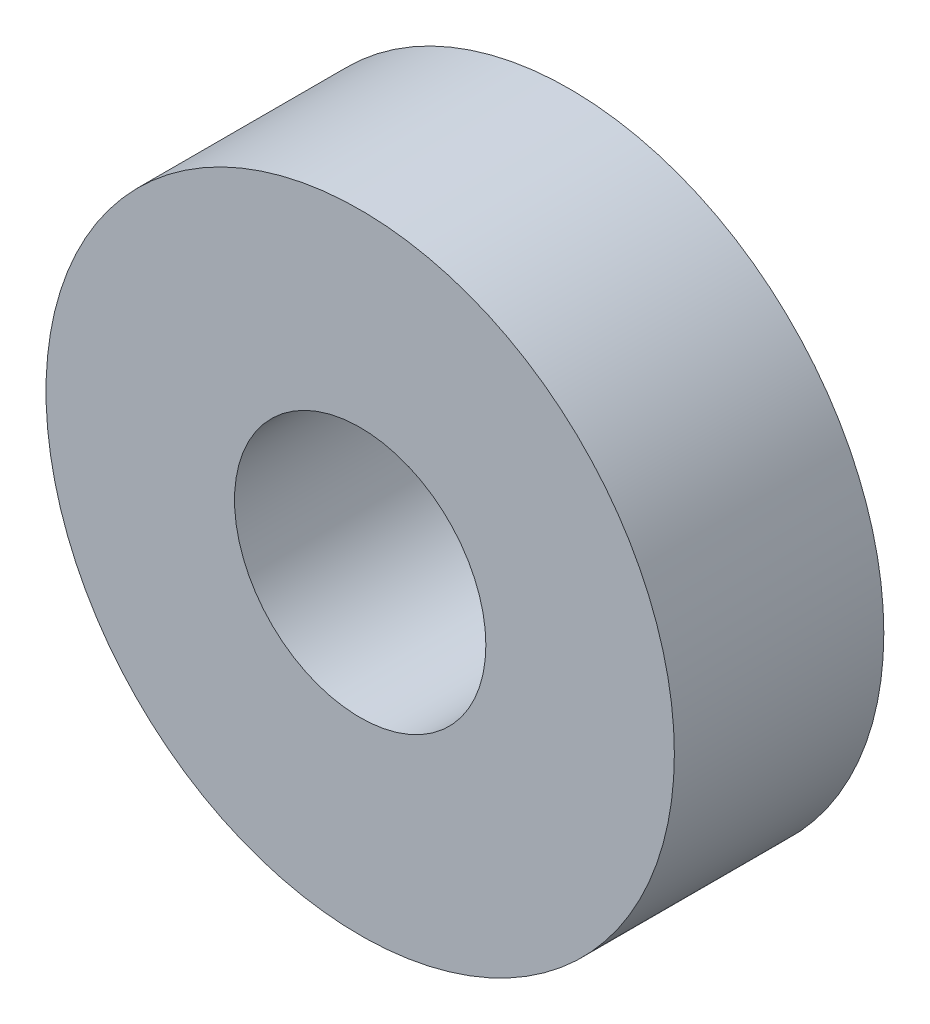
ISO-10303-21;
HEADER;
FILE_DESCRIPTION(('STEP AP214'),'2;1');
FILE_NAME('part.step','',(''),(''),'','','');
FILE_SCHEMA(('AUTOMOTIVE_DESIGN { 1 0 10303 214 1 1 1 1 }'));
ENDSEC;
DATA;
#1=APPLICATION_CONTEXT('core data for automotive mechanical design processes');
#2=APPLICATION_PROTOCOL_DEFINITION('international standard','automotive_design',2000,#1);
#3=PRODUCT_CONTEXT('',#1,'mechanical');
#4=PRODUCT('Part','Part','',(#3));
#5=PRODUCT_RELATED_PRODUCT_CATEGORY('part','',(#4));
#6=PRODUCT_DEFINITION_FORMATION('','',#4);
#7=PRODUCT_DEFINITION_CONTEXT('part definition',#1,'design');
#8=PRODUCT_DEFINITION('design','',#6,#7);
#9=PRODUCT_DEFINITION_SHAPE('','',#8);
#10=(LENGTH_UNIT() NAMED_UNIT(*) SI_UNIT(.MILLI.,.METRE.));
#11=(NAMED_UNIT(*) PLANE_ANGLE_UNIT() SI_UNIT($,.RADIAN.));
#12=(NAMED_UNIT(*) SI_UNIT($,.STERADIAN.) SOLID_ANGLE_UNIT());
#13=UNCERTAINTY_MEASURE_WITH_UNIT(LENGTH_MEASURE(1.E-05),#10,'distance_accuracy_value','');
#14=(GEOMETRIC_REPRESENTATION_CONTEXT(3) GLOBAL_UNCERTAINTY_ASSIGNED_CONTEXT((#13)) GLOBAL_UNIT_ASSIGNED_CONTEXT((#10,
#11,#12)) REPRESENTATION_CONTEXT('',''));
#15=CARTESIAN_POINT('',(0.,0.,0.));
#16=DIRECTION('',(0.,0.,1.));
#17=DIRECTION('',(1.,0.,0.));
#18=AXIS2_PLACEMENT_3D('',#15,#16,#17);
#19=CARTESIAN_POINT('',(0.,0.,10.));
#20=DIRECTION('',(0.,0.,1.));
#21=DIRECTION('',(1.,0.,0.));
#22=AXIS2_PLACEMENT_3D('',#19,#20,#21);
#23=PLANE('',#22);
#24=CARTESIAN_POINT('',(0.,0.,10.));
#25=DIRECTION('',(0.,0.,1.));
#26=DIRECTION('',(1.,0.,0.));
#27=AXIS2_PLACEMENT_3D('',#24,#25,#26);
#28=CIRCLE('',#27,15.);
#29=CARTESIAN_POINT('',(15.,0.,10.));
#30=VERTEX_POINT('',#29);
#31=EDGE_CURVE('E10',#30,#30,#28,.T.);
#32=ORIENTED_EDGE('',*,*,#31,.T.);
#33=EDGE_LOOP('',(#32));
#34=FACE_BOUND('',#33,.T.);
#35=CARTESIAN_POINT('',(0.,0.,10.));
#36=DIRECTION('',(0.,0.,1.));
#37=DIRECTION('',(1.,0.,0.));
#38=AXIS2_PLACEMENT_3D('',#35,#36,#37);
#39=CIRCLE('',#38,6.);
#40=CARTESIAN_POINT('',(6.,0.,10.));
#41=VERTEX_POINT('',#40);
#42=EDGE_CURVE('E44',#41,#41,#39,.T.);
#43=ORIENTED_EDGE('',*,*,#42,.F.);
#44=EDGE_LOOP('',(#43));
#45=FACE_BOUND('',#44,.T.);
#46=ADVANCED_FACE('F33',(#34,#45),#23,.T.);
#47=CARTESIAN_POINT('',(0.,0.,0.));
#48=DIRECTION('',(0.,0.,1.));
#49=DIRECTION('',(1.,0.,0.));
#50=AXIS2_PLACEMENT_3D('',#47,#48,#49);
#51=PLANE('',#50);
#52=CARTESIAN_POINT('',(0.,0.,0.));
#53=DIRECTION('',(0.,0.,1.));
#54=DIRECTION('',(1.,0.,0.));
#55=AXIS2_PLACEMENT_3D('',#52,#53,#54);
#56=CIRCLE('',#55,15.);
#57=CARTESIAN_POINT('',(15.,0.,0.));
#58=VERTEX_POINT('',#57);
#59=EDGE_CURVE('E37',#58,#58,#56,.T.);
#60=ORIENTED_EDGE('',*,*,#59,.F.);
#61=EDGE_LOOP('',(#60));
#62=FACE_BOUND('',#61,.T.);
#63=CARTESIAN_POINT('',(0.,0.,0.));
#64=DIRECTION('',(0.,0.,1.));
#65=DIRECTION('',(1.,0.,0.));
#66=AXIS2_PLACEMENT_3D('',#63,#64,#65);
#67=CIRCLE('',#66,6.);
#68=CARTESIAN_POINT('',(6.,0.,0.));
#69=VERTEX_POINT('',#68);
#70=EDGE_CURVE('E46',#69,#69,#67,.T.);
#71=ORIENTED_EDGE('',*,*,#70,.T.);
#72=EDGE_LOOP('',(#71));
#73=FACE_BOUND('',#72,.T.);
#74=ADVANCED_FACE('F56',(#62,#73),#51,.F.);
#75=CARTESIAN_POINT('',(0.,0.,10.));
#76=DIRECTION('',(0.,0.,-1.));
#77=DIRECTION('',(-1.,0.,0.));
#78=AXIS2_PLACEMENT_3D('',#75,#76,#77);
#79=CYLINDRICAL_SURFACE('',#78,15.);
#80=ORIENTED_EDGE('',*,*,#31,.F.);
#81=EDGE_LOOP('',(#80));
#82=FACE_BOUND('',#81,.T.);
#83=ORIENTED_EDGE('',*,*,#59,.T.);
#84=EDGE_LOOP('',(#83));
#85=FACE_BOUND('',#84,.T.);
#86=ADVANCED_FACE('F35',(#82,#85),#79,.T.);
#87=CARTESIAN_POINT('',(0.,0.,10.));
#88=DIRECTION('',(0.,0.,-1.));
#89=DIRECTION('',(-1.,0.,0.));
#90=AXIS2_PLACEMENT_3D('',#87,#88,#89);
#91=CYLINDRICAL_SURFACE('',#90,6.);
#92=ORIENTED_EDGE('',*,*,#42,.T.);
#93=EDGE_LOOP('',(#92));
#94=FACE_BOUND('',#93,.T.);
#95=ORIENTED_EDGE('',*,*,#70,.F.);
#96=EDGE_LOOP('',(#95));
#97=FACE_BOUND('',#96,.T.);
#98=ADVANCED_FACE('F52',(#94,#97),#91,.F.);
#99=CLOSED_SHELL('',(#46,#74,#86,#98));
#100=MANIFOLD_SOLID_BREP('B2',#99);
#101=ADVANCED_BREP_SHAPE_REPRESENTATION('',(#18,#100),#14);
#102=SHAPE_DEFINITION_REPRESENTATION(#9,#101);
ENDSEC;
END-ISO-10303-21;
